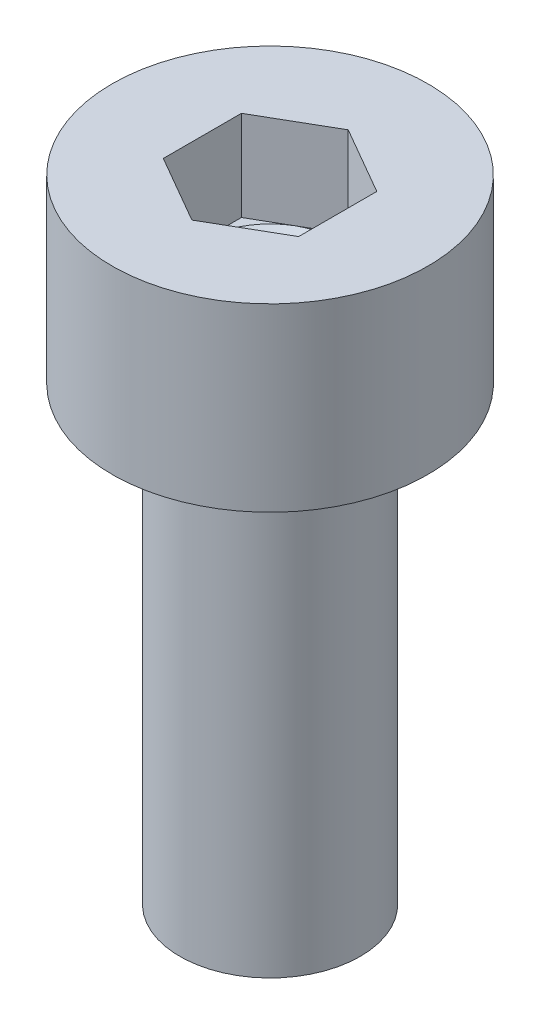
ISO-10303-21;
HEADER;
FILE_DESCRIPTION(('STEP AP214'),'2;1');
FILE_NAME('part.step','',(''),(''),'','','');
FILE_SCHEMA(('AUTOMOTIVE_DESIGN { 1 0 10303 214 1 1 1 1 }'));
ENDSEC;
DATA;
#1=APPLICATION_CONTEXT('core data for automotive mechanical design processes');
#2=APPLICATION_PROTOCOL_DEFINITION('international standard','automotive_design',2000,#1);
#3=PRODUCT_CONTEXT('',#1,'mechanical');
#4=PRODUCT('Part','Part','',(#3));
#5=PRODUCT_RELATED_PRODUCT_CATEGORY('part','',(#4));
#6=PRODUCT_DEFINITION_FORMATION('','',#4);
#7=PRODUCT_DEFINITION_CONTEXT('part definition',#1,'design');
#8=PRODUCT_DEFINITION('design','',#6,#7);
#9=PRODUCT_DEFINITION_SHAPE('','',#8);
#10=(LENGTH_UNIT() NAMED_UNIT(*) SI_UNIT(.MILLI.,.METRE.));
#11=(NAMED_UNIT(*) PLANE_ANGLE_UNIT() SI_UNIT($,.RADIAN.));
#12=(NAMED_UNIT(*) SI_UNIT($,.STERADIAN.) SOLID_ANGLE_UNIT());
#13=UNCERTAINTY_MEASURE_WITH_UNIT(LENGTH_MEASURE(1.E-05),#10,'distance_accuracy_value','');
#14=(GEOMETRIC_REPRESENTATION_CONTEXT(3) GLOBAL_UNCERTAINTY_ASSIGNED_CONTEXT((#13)) GLOBAL_UNIT_ASSIGNED_CONTEXT((#10,
#11,#12)) REPRESENTATION_CONTEXT('',''));
#15=CARTESIAN_POINT('',(0.,0.,0.));
#16=DIRECTION('',(0.,0.,1.));
#17=DIRECTION('',(1.,0.,0.));
#18=AXIS2_PLACEMENT_3D('',#15,#16,#17);
#19=CARTESIAN_POINT('',(0.,0.,0.));
#20=DIRECTION('',(0.,-1.,0.));
#21=DIRECTION('',(1.,0.,0.));
#22=AXIS2_PLACEMENT_3D('',#19,#20,#21);
#23=PLANE('',#22);
#24=CARTESIAN_POINT('',(0.,0.,0.));
#25=DIRECTION('',(0.,1.,0.));
#26=DIRECTION('',(-1.,0.,0.));
#27=AXIS2_PLACEMENT_3D('',#24,#25,#26);
#28=CIRCLE('',#27,3.5);
#29=CARTESIAN_POINT('',(-3.5,0.,0.));
#30=VERTEX_POINT('',#29);
#31=EDGE_CURVE('E11',#30,#30,#28,.T.);
#32=ORIENTED_EDGE('',*,*,#31,.T.);
#33=EDGE_LOOP('',(#32));
#34=FACE_BOUND('',#33,.T.);
#35=DIRECTION('',(-0.866025403784439,0.,0.5));
#36=VECTOR('',#35,1.);
#37=CARTESIAN_POINT('',(0.,0.,-1.73205080756888));
#38=LINE('',#37,#36);
#39=CARTESIAN_POINT('',(0.,0.,-1.73205080756888));
#40=VERTEX_POINT('',#39);
#41=CARTESIAN_POINT('',(-1.5,0.,-0.866025403784439));
#42=VERTEX_POINT('',#41);
#43=EDGE_CURVE('E152',#40,#42,#38,.T.);
#44=ORIENTED_EDGE('',*,*,#43,.F.);
#45=DIRECTION('',(-0.866025403784439,0.,-0.5));
#46=VECTOR('',#45,1.);
#47=CARTESIAN_POINT('',(1.5,0.,-0.866025403784439));
#48=LINE('',#47,#46);
#49=CARTESIAN_POINT('',(1.5,0.,-0.866025403784439));
#50=VERTEX_POINT('',#49);
#51=EDGE_CURVE('E53',#50,#40,#48,.T.);
#52=ORIENTED_EDGE('',*,*,#51,.F.);
#53=DIRECTION('',(0.,0.,-1.));
#54=VECTOR('',#53,1.);
#55=CARTESIAN_POINT('',(1.5,0.,0.866025403784439));
#56=LINE('',#55,#54);
#57=CARTESIAN_POINT('',(1.5,0.,0.866025403784439));
#58=VERTEX_POINT('',#57);
#59=EDGE_CURVE('E123',#58,#50,#56,.T.);
#60=ORIENTED_EDGE('',*,*,#59,.F.);
#61=DIRECTION('',(0.866025403784439,0.,-0.5));
#62=VECTOR('',#61,1.);
#63=CARTESIAN_POINT('',(0.,0.,1.73205080756888));
#64=LINE('',#63,#62);
#65=CARTESIAN_POINT('',(0.,0.,1.73205080756888));
#66=VERTEX_POINT('',#65);
#67=EDGE_CURVE('E159',#66,#58,#64,.T.);
#68=ORIENTED_EDGE('',*,*,#67,.F.);
#69=DIRECTION('',(0.866025403784439,0.,0.5));
#70=VECTOR('',#69,1.);
#71=CARTESIAN_POINT('',(-1.5,0.,0.866025403784439));
#72=LINE('',#71,#70);
#73=CARTESIAN_POINT('',(-1.5,0.,0.866025403784439));
#74=VERTEX_POINT('',#73);
#75=EDGE_CURVE('E156',#74,#66,#72,.T.);
#76=ORIENTED_EDGE('',*,*,#75,.F.);
#77=DIRECTION('',(0.,0.,1.));
#78=VECTOR('',#77,1.);
#79=CARTESIAN_POINT('',(-1.5,0.,-0.866025403784439));
#80=LINE('',#79,#78);
#81=EDGE_CURVE('E154',#42,#74,#80,.T.);
#82=ORIENTED_EDGE('',*,*,#81,.F.);
#83=EDGE_LOOP('',(#44,#52,#60,#68,#76,#82));
#84=FACE_BOUND('',#83,.T.);
#85=ADVANCED_FACE('F39',(#34,#84),#23,.F.);
#86=CARTESIAN_POINT('',(0.,0.,0.));
#87=DIRECTION('',(0.,1.,0.));
#88=DIRECTION('',(-1.,0.,0.));
#89=AXIS2_PLACEMENT_3D('',#86,#87,#88);
#90=CYLINDRICAL_SURFACE('',#89,3.5);
#91=ORIENTED_EDGE('',*,*,#31,.F.);
#92=EDGE_LOOP('',(#91));
#93=FACE_BOUND('',#92,.T.);
#94=CARTESIAN_POINT('',(0.,-4.,0.));
#95=DIRECTION('',(0.,1.,0.));
#96=DIRECTION('',(-1.,0.,0.));
#97=AXIS2_PLACEMENT_3D('',#94,#95,#96);
#98=CIRCLE('',#97,3.5);
#99=CARTESIAN_POINT('',(-3.5,-4.,0.));
#100=VERTEX_POINT('',#99);
#101=EDGE_CURVE('E46',#100,#100,#98,.T.);
#102=ORIENTED_EDGE('',*,*,#101,.T.);
#103=EDGE_LOOP('',(#102));
#104=FACE_BOUND('',#103,.T.);
#105=ADVANCED_FACE('F188',(#93,#104),#90,.T.);
#106=CARTESIAN_POINT('',(3.5,-4.,0.));
#107=DIRECTION('',(0.,1.,0.));
#108=DIRECTION('',(-1.,0.,0.));
#109=AXIS2_PLACEMENT_3D('',#106,#107,#108);
#110=PLANE('',#109);
#111=ORIENTED_EDGE('',*,*,#101,.F.);
#112=EDGE_LOOP('',(#111));
#113=FACE_BOUND('',#112,.T.);
#114=CARTESIAN_POINT('',(0.,-4.,0.));
#115=DIRECTION('',(0.,1.,0.));
#116=DIRECTION('',(-1.,0.,0.));
#117=AXIS2_PLACEMENT_3D('',#114,#115,#116);
#118=CIRCLE('',#117,2.);
#119=CARTESIAN_POINT('',(-2.,-4.,0.));
#120=VERTEX_POINT('',#119);
#121=EDGE_CURVE('E183',#120,#120,#118,.T.);
#122=ORIENTED_EDGE('',*,*,#121,.T.);
#123=EDGE_LOOP('',(#122));
#124=FACE_BOUND('',#123,.T.);
#125=ADVANCED_FACE('F190',(#113,#124),#110,.F.);
#126=CARTESIAN_POINT('',(0.,0.,0.));
#127=DIRECTION('',(0.,1.,0.));
#128=DIRECTION('',(-1.,0.,0.));
#129=AXIS2_PLACEMENT_3D('',#126,#127,#128);
#130=CYLINDRICAL_SURFACE('',#129,2.);
#131=ORIENTED_EDGE('',*,*,#121,.F.);
#132=EDGE_LOOP('',(#131));
#133=FACE_BOUND('',#132,.T.);
#134=CARTESIAN_POINT('',(0.,-14.,0.));
#135=DIRECTION('',(0.,1.,0.));
#136=DIRECTION('',(-1.,0.,0.));
#137=AXIS2_PLACEMENT_3D('',#134,#135,#136);
#138=CIRCLE('',#137,2.);
#139=CARTESIAN_POINT('',(-2.,-14.,0.));
#140=VERTEX_POINT('',#139);
#141=EDGE_CURVE('E179',#140,#140,#138,.T.);
#142=ORIENTED_EDGE('',*,*,#141,.T.);
#143=EDGE_LOOP('',(#142));
#144=FACE_BOUND('',#143,.T.);
#145=ADVANCED_FACE('F193',(#133,#144),#130,.T.);
#146=CARTESIAN_POINT('',(2.,-14.,0.));
#147=DIRECTION('',(0.,1.,0.));
#148=DIRECTION('',(-1.,0.,0.));
#149=AXIS2_PLACEMENT_3D('',#146,#147,#148);
#150=PLANE('',#149);
#151=ORIENTED_EDGE('',*,*,#141,.F.);
#152=EDGE_LOOP('',(#151));
#153=FACE_BOUND('',#152,.T.);
#154=ADVANCED_FACE('F199',(#153),#150,.F.);
#155=CARTESIAN_POINT('',(1.5,-2.,-0.866025403784439));
#156=DIRECTION('',(0.5,0.,-0.866025403784439));
#157=DIRECTION('',(-0.866025403784439,0.,-0.5));
#158=AXIS2_PLACEMENT_3D('',#155,#156,#157);
#159=PLANE('',#158);
#160=DIRECTION('',(-0.866025403784439,0.,-0.5));
#161=VECTOR('',#160,1.);
#162=CARTESIAN_POINT('',(1.5,-2.,-0.866025403784439));
#163=LINE('',#162,#161);
#164=CARTESIAN_POINT('',(1.5,-2.,-0.866025403784439));
#165=VERTEX_POINT('',#164);
#166=CARTESIAN_POINT('',(0.75,-2.,-1.29903810567666));
#167=VERTEX_POINT('',#166);
#168=EDGE_CURVE('E122',#165,#167,#163,.T.);
#169=ORIENTED_EDGE('',*,*,#168,.F.);
#170=DIRECTION('',(0.,1.,0.));
#171=VECTOR('',#170,1.);
#172=CARTESIAN_POINT('',(1.5,-2.,-0.866025403784439));
#173=LINE('',#172,#171);
#174=EDGE_CURVE('E162',#165,#50,#173,.T.);
#175=ORIENTED_EDGE('',*,*,#174,.T.);
#176=ORIENTED_EDGE('',*,*,#51,.T.);
#177=DIRECTION('',(0.,1.,0.));
#178=VECTOR('',#177,1.);
#179=CARTESIAN_POINT('',(0.,-2.,-1.73205080756888));
#180=LINE('',#179,#178);
#181=CARTESIAN_POINT('',(0.,-2.,-1.73205080756888));
#182=VERTEX_POINT('',#181);
#183=EDGE_CURVE('E125',#182,#40,#180,.T.);
#184=ORIENTED_EDGE('',*,*,#183,.F.);
#185=EDGE_CURVE('E114',#167,#182,#163,.T.);
#186=ORIENTED_EDGE('',*,*,#185,.F.);
#187=EDGE_LOOP('',(#169,#175,#176,#184,#186));
#188=FACE_BOUND('',#187,.T.);
#189=ADVANCED_FACE('F126',(#188),#159,.F.);
#190=CARTESIAN_POINT('',(1.5,-2.,0.866025403784439));
#191=DIRECTION('',(1.,0.,0.));
#192=DIRECTION('',(0.,0.,-1.));
#193=AXIS2_PLACEMENT_3D('',#190,#191,#192);
#194=PLANE('',#193);
#195=DIRECTION('',(0.,0.,-1.));
#196=VECTOR('',#195,1.);
#197=CARTESIAN_POINT('',(1.5,-2.,0.866025403784439));
#198=LINE('',#197,#196);
#199=CARTESIAN_POINT('',(1.5,-2.,0.866025403784439));
#200=VERTEX_POINT('',#199);
#201=CARTESIAN_POINT('',(1.5,-2.,0.));
#202=VERTEX_POINT('',#201);
#203=EDGE_CURVE('E130',#200,#202,#198,.T.);
#204=ORIENTED_EDGE('',*,*,#203,.F.);
#205=DIRECTION('',(0.,1.,0.));
#206=VECTOR('',#205,1.);
#207=CARTESIAN_POINT('',(1.5,-2.,0.866025403784439));
#208=LINE('',#207,#206);
#209=EDGE_CURVE('E165',#200,#58,#208,.T.);
#210=ORIENTED_EDGE('',*,*,#209,.T.);
#211=ORIENTED_EDGE('',*,*,#59,.T.);
#212=ORIENTED_EDGE('',*,*,#174,.F.);
#213=EDGE_CURVE('E148',#202,#165,#198,.T.);
#214=ORIENTED_EDGE('',*,*,#213,.F.);
#215=EDGE_LOOP('',(#204,#210,#211,#212,#214));
#216=FACE_BOUND('',#215,.T.);
#217=ADVANCED_FACE('F208',(#216),#194,.F.);
#218=CARTESIAN_POINT('',(0.,-2.,1.73205080756888));
#219=DIRECTION('',(0.5,0.,0.866025403784439));
#220=DIRECTION('',(0.866025403784439,0.,-0.5));
#221=AXIS2_PLACEMENT_3D('',#218,#219,#220);
#222=PLANE('',#221);
#223=DIRECTION('',(0.866025403784439,0.,-0.5));
#224=VECTOR('',#223,1.);
#225=CARTESIAN_POINT('',(0.,-2.,1.73205080756888));
#226=LINE('',#225,#224);
#227=CARTESIAN_POINT('',(0.,-2.,1.73205080756888));
#228=VERTEX_POINT('',#227);
#229=CARTESIAN_POINT('',(0.75,-2.,1.29903810567666));
#230=VERTEX_POINT('',#229);
#231=EDGE_CURVE('E61',#228,#230,#226,.T.);
#232=ORIENTED_EDGE('',*,*,#231,.F.);
#233=DIRECTION('',(0.,1.,0.));
#234=VECTOR('',#233,1.);
#235=CARTESIAN_POINT('',(0.,-2.,1.73205080756888));
#236=LINE('',#235,#234);
#237=EDGE_CURVE('E168',#228,#66,#236,.T.);
#238=ORIENTED_EDGE('',*,*,#237,.T.);
#239=ORIENTED_EDGE('',*,*,#67,.T.);
#240=ORIENTED_EDGE('',*,*,#209,.F.);
#241=EDGE_CURVE('E146',#230,#200,#226,.T.);
#242=ORIENTED_EDGE('',*,*,#241,.F.);
#243=EDGE_LOOP('',(#232,#238,#239,#240,#242));
#244=FACE_BOUND('',#243,.T.);
#245=ADVANCED_FACE('F249',(#244),#222,.F.);
#246=CARTESIAN_POINT('',(-1.5,-2.,0.866025403784439));
#247=DIRECTION('',(-0.5,0.,0.866025403784439));
#248=DIRECTION('',(0.866025403784439,0.,0.5));
#249=AXIS2_PLACEMENT_3D('',#246,#247,#248);
#250=PLANE('',#249);
#251=DIRECTION('',(0.866025403784439,0.,0.5));
#252=VECTOR('',#251,1.);
#253=CARTESIAN_POINT('',(-1.5,-2.,0.866025403784439));
#254=LINE('',#253,#252);
#255=CARTESIAN_POINT('',(-1.5,-2.,0.866025403784439));
#256=VERTEX_POINT('',#255);
#257=CARTESIAN_POINT('',(-0.75,-2.,1.29903810567666));
#258=VERTEX_POINT('',#257);
#259=EDGE_CURVE('E143',#256,#258,#254,.T.);
#260=ORIENTED_EDGE('',*,*,#259,.F.);
#261=DIRECTION('',(0.,1.,0.));
#262=VECTOR('',#261,1.);
#263=CARTESIAN_POINT('',(-1.5,-2.,0.866025403784439));
#264=LINE('',#263,#262);
#265=EDGE_CURVE('E171',#256,#74,#264,.T.);
#266=ORIENTED_EDGE('',*,*,#265,.T.);
#267=ORIENTED_EDGE('',*,*,#75,.T.);
#268=ORIENTED_EDGE('',*,*,#237,.F.);
#269=EDGE_CURVE('E142',#258,#228,#254,.T.);
#270=ORIENTED_EDGE('',*,*,#269,.F.);
#271=EDGE_LOOP('',(#260,#266,#267,#268,#270));
#272=FACE_BOUND('',#271,.T.);
#273=ADVANCED_FACE('F244',(#272),#250,.F.);
#274=CARTESIAN_POINT('',(-1.5,-2.,-0.866025403784439));
#275=DIRECTION('',(-1.,0.,0.));
#276=DIRECTION('',(0.,0.,1.));
#277=AXIS2_PLACEMENT_3D('',#274,#275,#276);
#278=PLANE('',#277);
#279=DIRECTION('',(0.,0.,1.));
#280=VECTOR('',#279,1.);
#281=CARTESIAN_POINT('',(-1.5,-2.,-0.866025403784439));
#282=LINE('',#281,#280);
#283=CARTESIAN_POINT('',(-1.5,-2.,-0.866025403784439));
#284=VERTEX_POINT('',#283);
#285=CARTESIAN_POINT('',(-1.5,-2.,0.));
#286=VERTEX_POINT('',#285);
#287=EDGE_CURVE('E138',#284,#286,#282,.T.);
#288=ORIENTED_EDGE('',*,*,#287,.F.);
#289=DIRECTION('',(0.,1.,0.));
#290=VECTOR('',#289,1.);
#291=CARTESIAN_POINT('',(-1.5,-2.,-0.866025403784439));
#292=LINE('',#291,#290);
#293=EDGE_CURVE('E129',#284,#42,#292,.T.);
#294=ORIENTED_EDGE('',*,*,#293,.T.);
#295=ORIENTED_EDGE('',*,*,#81,.T.);
#296=ORIENTED_EDGE('',*,*,#265,.F.);
#297=EDGE_CURVE('E136',#286,#256,#282,.T.);
#298=ORIENTED_EDGE('',*,*,#297,.F.);
#299=EDGE_LOOP('',(#288,#294,#295,#296,#298));
#300=FACE_BOUND('',#299,.T.);
#301=ADVANCED_FACE('F224',(#300),#278,.F.);
#302=CARTESIAN_POINT('',(0.,-2.,-1.73205080756888));
#303=DIRECTION('',(-0.5,0.,-0.866025403784439));
#304=DIRECTION('',(-0.866025403784439,0.,0.5));
#305=AXIS2_PLACEMENT_3D('',#302,#303,#304);
#306=PLANE('',#305);
#307=DIRECTION('',(-0.866025403784439,0.,0.5));
#308=VECTOR('',#307,1.);
#309=CARTESIAN_POINT('',(0.,-2.,-1.73205080756888));
#310=LINE('',#309,#308);
#311=CARTESIAN_POINT('',(-0.75,-2.,-1.29903810567666));
#312=VERTEX_POINT('',#311);
#313=EDGE_CURVE('E117',#182,#312,#310,.T.);
#314=ORIENTED_EDGE('',*,*,#313,.F.);
#315=ORIENTED_EDGE('',*,*,#183,.T.);
#316=ORIENTED_EDGE('',*,*,#43,.T.);
#317=ORIENTED_EDGE('',*,*,#293,.F.);
#318=EDGE_CURVE('E135',#312,#284,#310,.T.);
#319=ORIENTED_EDGE('',*,*,#318,.F.);
#320=EDGE_LOOP('',(#314,#315,#316,#317,#319));
#321=FACE_BOUND('',#320,.T.);
#322=ADVANCED_FACE('F133',(#321),#306,.F.);
#323=CARTESIAN_POINT('',(0.,-2.,0.));
#324=DIRECTION('',(0.,1.,0.));
#325=DIRECTION('',(0.,0.,1.));
#326=AXIS2_PLACEMENT_3D('',#323,#324,#325);
#327=PLANE('',#326);
#328=ORIENTED_EDGE('',*,*,#241,.T.);
#329=ORIENTED_EDGE('',*,*,#203,.T.);
#330=CARTESIAN_POINT('',(0.,-2.,0.));
#331=DIRECTION('',(0.,1.,0.));
#332=DIRECTION('',(-1.,0.,0.));
#333=AXIS2_PLACEMENT_3D('',#330,#331,#332);
#334=CIRCLE('',#333,1.5);
#335=EDGE_CURVE('E236',#230,#202,#334,.T.);
#336=ORIENTED_EDGE('',*,*,#335,.F.);
#337=EDGE_LOOP('',(#328,#329,#336));
#338=FACE_BOUND('',#337,.T.);
#339=ADVANCED_FACE('F255',(#338),#327,.T.);
#340=ORIENTED_EDGE('',*,*,#213,.T.);
#341=ORIENTED_EDGE('',*,*,#168,.T.);
#342=EDGE_CURVE('E235',#202,#167,#334,.T.);
#343=ORIENTED_EDGE('',*,*,#342,.F.);
#344=EDGE_LOOP('',(#340,#341,#343));
#345=FACE_BOUND('',#344,.T.);
#346=ADVANCED_FACE('F257',(#345),#327,.T.);
#347=ORIENTED_EDGE('',*,*,#185,.T.);
#348=ORIENTED_EDGE('',*,*,#313,.T.);
#349=EDGE_CURVE('E119',#167,#312,#334,.T.);
#350=ORIENTED_EDGE('',*,*,#349,.F.);
#351=EDGE_LOOP('',(#347,#348,#350));
#352=FACE_BOUND('',#351,.T.);
#353=ADVANCED_FACE('F115',(#352),#327,.T.);
#354=ORIENTED_EDGE('',*,*,#318,.T.);
#355=ORIENTED_EDGE('',*,*,#287,.T.);
#356=EDGE_CURVE('E164',#312,#286,#334,.T.);
#357=ORIENTED_EDGE('',*,*,#356,.F.);
#358=EDGE_LOOP('',(#354,#355,#357));
#359=FACE_BOUND('',#358,.T.);
#360=ADVANCED_FACE('F229',(#359),#327,.T.);
#361=ORIENTED_EDGE('',*,*,#297,.T.);
#362=ORIENTED_EDGE('',*,*,#259,.T.);
#363=EDGE_CURVE('E176',#286,#258,#334,.T.);
#364=ORIENTED_EDGE('',*,*,#363,.F.);
#365=EDGE_LOOP('',(#361,#362,#364));
#366=FACE_BOUND('',#365,.T.);
#367=ADVANCED_FACE('F246',(#366),#327,.T.);
#368=ORIENTED_EDGE('',*,*,#269,.T.);
#369=ORIENTED_EDGE('',*,*,#231,.T.);
#370=EDGE_CURVE('E180',#258,#230,#334,.T.);
#371=ORIENTED_EDGE('',*,*,#370,.F.);
#372=EDGE_LOOP('',(#368,#369,#371));
#373=FACE_BOUND('',#372,.T.);
#374=ADVANCED_FACE('F240',(#373),#327,.T.);
#375=CARTESIAN_POINT('',(0.,-2.86602540378446,0.));
#376=DIRECTION('',(0.,1.,0.));
#377=DIRECTION('',(-1.,0.,0.));
#378=AXIS2_PLACEMENT_3D('',#375,#376,#377);
#379=CONICAL_SURFACE('',#378,0.,1.04719755119659);
#380=ORIENTED_EDGE('',*,*,#363,.T.);
#381=ORIENTED_EDGE('',*,*,#370,.T.);
#382=ORIENTED_EDGE('',*,*,#335,.T.);
#383=ORIENTED_EDGE('',*,*,#342,.T.);
#384=ORIENTED_EDGE('',*,*,#349,.T.);
#385=ORIENTED_EDGE('',*,*,#356,.T.);
#386=EDGE_LOOP('',(#380,#381,#382,#383,#384,#385));
#387=FACE_BOUND('',#386,.T.);
#388=CARTESIAN_POINT('',(0.,-2.86602540378446,0.));
#389=VERTEX_POINT('',#388);
#390=VERTEX_LOOP('',#389);
#391=FACE_BOUND('',#390,.T.);
#392=ADVANCED_FACE('F231',(#387,#391),#379,.F.);
#393=CLOSED_SHELL('',(#85,#105,#125,#145,#154,#189,#217,#245,#273,#301,#322,#339,#346,#353,#360,
#367,#374,#392));
#394=MANIFOLD_SOLID_BREP('B2',#393);
#395=ADVANCED_BREP_SHAPE_REPRESENTATION('',(#18,#394),#14);
#396=SHAPE_DEFINITION_REPRESENTATION(#9,#395);
ENDSEC;
END-ISO-10303-21;
